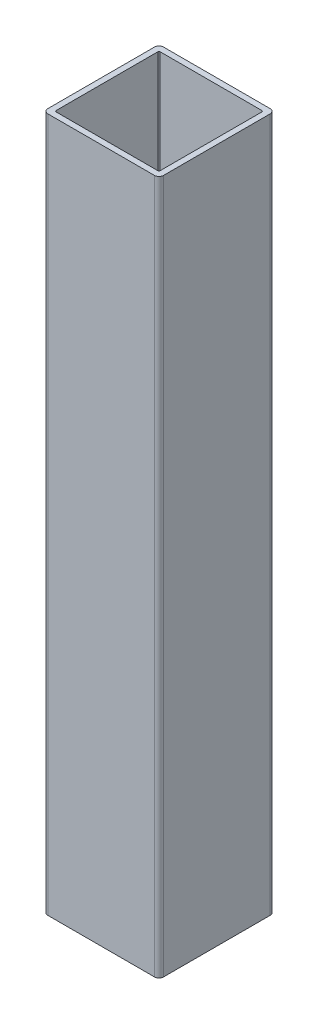
ISO-10303-21;
HEADER;
FILE_DESCRIPTION(('STEP AP214'),'2;1');
FILE_NAME('part.step','',(''),(''),'','','');
FILE_SCHEMA(('AUTOMOTIVE_DESIGN { 1 0 10303 214 1 1 1 1 }'));
ENDSEC;
DATA;
#1=APPLICATION_CONTEXT('core data for automotive mechanical design processes');
#2=APPLICATION_PROTOCOL_DEFINITION('international standard','automotive_design',2000,#1);
#3=PRODUCT_CONTEXT('',#1,'mechanical');
#4=PRODUCT('Part','Part','',(#3));
#5=PRODUCT_RELATED_PRODUCT_CATEGORY('part','',(#4));
#6=PRODUCT_DEFINITION_FORMATION('','',#4);
#7=PRODUCT_DEFINITION_CONTEXT('part definition',#1,'design');
#8=PRODUCT_DEFINITION('design','',#6,#7);
#9=PRODUCT_DEFINITION_SHAPE('','',#8);
#10=(LENGTH_UNIT() NAMED_UNIT(*) SI_UNIT(.MILLI.,.METRE.));
#11=(NAMED_UNIT(*) PLANE_ANGLE_UNIT() SI_UNIT($,.RADIAN.));
#12=(NAMED_UNIT(*) SI_UNIT($,.STERADIAN.) SOLID_ANGLE_UNIT());
#13=UNCERTAINTY_MEASURE_WITH_UNIT(LENGTH_MEASURE(1.E-05),#10,'distance_accuracy_value','');
#14=(GEOMETRIC_REPRESENTATION_CONTEXT(3) GLOBAL_UNCERTAINTY_ASSIGNED_CONTEXT((#13)) GLOBAL_UNIT_ASSIGNED_CONTEXT((#10,
#11,#12)) REPRESENTATION_CONTEXT('',''));
#15=CARTESIAN_POINT('',(0.,0.,0.));
#16=DIRECTION('',(0.,0.,1.));
#17=DIRECTION('',(1.,0.,0.));
#18=AXIS2_PLACEMENT_3D('',#15,#16,#17);
#19=CARTESIAN_POINT('',(-1275.,100.,825.));
#20=DIRECTION('',(0.,0.,-1.));
#21=DIRECTION('',(-1.,0.,0.));
#22=AXIS2_PLACEMENT_3D('',#19,#20,#21);
#23=PLANE('',#22);
#24=DIRECTION('',(-1.,0.,0.));
#25=VECTOR('',#24,1.);
#26=CARTESIAN_POINT('',(-1275.,600.,825.));
#27=LINE('',#26,#25);
#28=CARTESIAN_POINT('',(-1179.,600.,825.));
#29=VERTEX_POINT('',#28);
#30=CARTESIAN_POINT('',(-1271.,600.,825.));
#31=VERTEX_POINT('',#30);
#32=EDGE_CURVE('E169',#29,#31,#27,.T.);
#33=ORIENTED_EDGE('',*,*,#32,.F.);
#34=DIRECTION('',(0.,-1.,0.));
#35=VECTOR('',#34,1.);
#36=CARTESIAN_POINT('',(-1179.,100.,825.));
#37=LINE('',#36,#35);
#38=CARTESIAN_POINT('',(-1179.,0.,825.));
#39=VERTEX_POINT('',#38);
#40=EDGE_CURVE('E245',#29,#39,#37,.T.);
#41=ORIENTED_EDGE('',*,*,#40,.T.);
#42=DIRECTION('',(1.,0.,0.));
#43=VECTOR('',#42,1.);
#44=CARTESIAN_POINT('',(0.,0.,825.));
#45=LINE('',#44,#43);
#46=CARTESIAN_POINT('',(-1271.,0.,825.));
#47=VERTEX_POINT('',#46);
#48=EDGE_CURVE('E212',#47,#39,#45,.T.);
#49=ORIENTED_EDGE('',*,*,#48,.F.);
#50=DIRECTION('',(0.,1.,0.));
#51=VECTOR('',#50,1.);
#52=CARTESIAN_POINT('',(-1271.,600.,825.));
#53=LINE('',#52,#51);
#54=EDGE_CURVE('E241',#47,#31,#53,.T.);
#55=ORIENTED_EDGE('',*,*,#54,.T.);
#56=EDGE_LOOP('',(#33,#41,#49,#55));
#57=FACE_BOUND('',#56,.T.);
#58=ADVANCED_FACE('F19',(#57),#23,.T.);
#59=CARTESIAN_POINT('',(-1175.,100.,825.));
#60=DIRECTION('',(1.,0.,0.));
#61=DIRECTION('',(0.,0.,-1.));
#62=AXIS2_PLACEMENT_3D('',#59,#60,#61);
#63=PLANE('',#62);
#64=DIRECTION('',(0.,0.,-1.));
#65=VECTOR('',#64,1.);
#66=CARTESIAN_POINT('',(-1175.,600.,50.));
#67=LINE('',#66,#65);
#68=CARTESIAN_POINT('',(-1175.,600.,921.));
#69=VERTEX_POINT('',#68);
#70=CARTESIAN_POINT('',(-1175.,600.,829.));
#71=VERTEX_POINT('',#70);
#72=EDGE_CURVE('E214',#69,#71,#67,.T.);
#73=ORIENTED_EDGE('',*,*,#72,.F.);
#74=DIRECTION('',(0.,1.,0.));
#75=VECTOR('',#74,1.);
#76=CARTESIAN_POINT('',(-1175.,100.,921.));
#77=LINE('',#76,#75);
#78=CARTESIAN_POINT('',(-1175.,0.,921.));
#79=VERTEX_POINT('',#78);
#80=EDGE_CURVE('E224',#69,#79,#77,.F.);
#81=ORIENTED_EDGE('',*,*,#80,.T.);
#82=DIRECTION('',(0.,0.,1.));
#83=VECTOR('',#82,1.);
#84=CARTESIAN_POINT('',(-1175.,0.,0.));
#85=LINE('',#84,#83);
#86=CARTESIAN_POINT('',(-1175.,0.,829.));
#87=VERTEX_POINT('',#86);
#88=EDGE_CURVE('E174',#87,#79,#85,.T.);
#89=ORIENTED_EDGE('',*,*,#88,.F.);
#90=DIRECTION('',(0.,-1.,0.));
#91=VECTOR('',#90,1.);
#92=CARTESIAN_POINT('',(-1175.,100.,829.));
#93=LINE('',#92,#91);
#94=EDGE_CURVE('E239',#87,#71,#93,.F.);
#95=ORIENTED_EDGE('',*,*,#94,.T.);
#96=EDGE_LOOP('',(#73,#81,#89,#95));
#97=FACE_BOUND('',#96,.T.);
#98=ADVANCED_FACE('F275',(#97),#63,.T.);
#99=CARTESIAN_POINT('',(0.,0.,0.));
#100=DIRECTION('',(0.,-1.,0.));
#101=DIRECTION('',(0.,0.,-1.));
#102=AXIS2_PLACEMENT_3D('',#99,#100,#101);
#103=PLANE('',#102);
#104=DIRECTION('',(0.,0.,-1.));
#105=VECTOR('',#104,1.);
#106=CARTESIAN_POINT('',(-1270.,0.,0.));
#107=LINE('',#106,#105);
#108=CARTESIAN_POINT('',(-1270.,0.,919.));
#109=VERTEX_POINT('',#108);
#110=CARTESIAN_POINT('',(-1270.,0.,831.));
#111=VERTEX_POINT('',#110);
#112=EDGE_CURVE('E208',#109,#111,#107,.T.);
#113=ORIENTED_EDGE('',*,*,#112,.F.);
#114=CARTESIAN_POINT('',(-1269.,0.,919.));
#115=DIRECTION('',(0.,-1.,0.));
#116=DIRECTION('',(0.,0.,-1.));
#117=AXIS2_PLACEMENT_3D('',#114,#115,#116);
#118=CIRCLE('',#117,1.);
#119=CARTESIAN_POINT('',(-1269.,0.,920.));
#120=VERTEX_POINT('',#119);
#121=EDGE_CURVE('E322',#109,#120,#118,.F.);
#122=ORIENTED_EDGE('',*,*,#121,.T.);
#123=DIRECTION('',(-1.,0.,0.));
#124=VECTOR('',#123,1.);
#125=CARTESIAN_POINT('',(0.,0.,920.));
#126=LINE('',#125,#124);
#127=CARTESIAN_POINT('',(-1181.,0.,920.));
#128=VERTEX_POINT('',#127);
#129=EDGE_CURVE('E206',#128,#120,#126,.T.);
#130=ORIENTED_EDGE('',*,*,#129,.F.);
#131=CARTESIAN_POINT('',(-1181.,0.,919.));
#132=DIRECTION('',(0.,-1.,0.));
#133=DIRECTION('',(0.,0.,-1.));
#134=AXIS2_PLACEMENT_3D('',#131,#132,#133);
#135=CIRCLE('',#134,1.);
#136=CARTESIAN_POINT('',(-1180.,0.,919.));
#137=VERTEX_POINT('',#136);
#138=EDGE_CURVE('E328',#128,#137,#135,.F.);
#139=ORIENTED_EDGE('',*,*,#138,.T.);
#140=DIRECTION('',(0.,0.,1.));
#141=VECTOR('',#140,1.);
#142=CARTESIAN_POINT('',(-1180.,0.,0.));
#143=LINE('',#142,#141);
#144=CARTESIAN_POINT('',(-1180.,0.,831.));
#145=VERTEX_POINT('',#144);
#146=EDGE_CURVE('E200',#145,#137,#143,.T.);
#147=ORIENTED_EDGE('',*,*,#146,.F.);
#148=CARTESIAN_POINT('',(-1181.,0.,831.));
#149=DIRECTION('',(0.,-1.,0.));
#150=DIRECTION('',(0.,0.,-1.));
#151=AXIS2_PLACEMENT_3D('',#148,#149,#150);
#152=CIRCLE('',#151,1.);
#153=CARTESIAN_POINT('',(-1181.,0.,830.));
#154=VERTEX_POINT('',#153);
#155=EDGE_CURVE('E12',#145,#154,#152,.F.);
#156=ORIENTED_EDGE('',*,*,#155,.T.);
#157=DIRECTION('',(1.,0.,0.));
#158=VECTOR('',#157,1.);
#159=CARTESIAN_POINT('',(0.,0.,830.));
#160=LINE('',#159,#158);
#161=CARTESIAN_POINT('',(-1269.,0.,830.));
#162=VERTEX_POINT('',#161);
#163=EDGE_CURVE('E205',#162,#154,#160,.T.);
#164=ORIENTED_EDGE('',*,*,#163,.F.);
#165=CARTESIAN_POINT('',(-1269.,0.,831.));
#166=DIRECTION('',(0.,-1.,0.));
#167=DIRECTION('',(0.,0.,-1.));
#168=AXIS2_PLACEMENT_3D('',#165,#166,#167);
#169=CIRCLE('',#168,1.);
#170=EDGE_CURVE('E315',#162,#111,#169,.F.);
#171=ORIENTED_EDGE('',*,*,#170,.T.);
#172=EDGE_LOOP('',(#113,#122,#130,#139,#147,#156,#164,#171));
#173=FACE_BOUND('',#172,.T.);
#174=DIRECTION('',(1.,0.,0.));
#175=VECTOR('',#174,1.);
#176=CARTESIAN_POINT('',(1175.,0.,925.));
#177=LINE('',#176,#175);
#178=CARTESIAN_POINT('',(-1271.,0.,925.));
#179=VERTEX_POINT('',#178);
#180=CARTESIAN_POINT('',(-1179.,0.,925.));
#181=VERTEX_POINT('',#180);
#182=EDGE_CURVE('E150',#179,#181,#177,.T.);
#183=ORIENTED_EDGE('',*,*,#182,.F.);
#184=CARTESIAN_POINT('',(-1271.,0.,921.));
#185=DIRECTION('',(0.,-1.,0.));
#186=DIRECTION('',(0.,0.,-1.));
#187=AXIS2_PLACEMENT_3D('',#184,#185,#186);
#188=CIRCLE('',#187,4.);
#189=CARTESIAN_POINT('',(-1275.,0.,921.));
#190=VERTEX_POINT('',#189);
#191=EDGE_CURVE('E132',#179,#190,#188,.T.);
#192=ORIENTED_EDGE('',*,*,#191,.T.);
#193=DIRECTION('',(0.,0.,-1.));
#194=VECTOR('',#193,1.);
#195=CARTESIAN_POINT('',(-1275.,0.,0.));
#196=LINE('',#195,#194);
#197=CARTESIAN_POINT('',(-1275.,0.,829.));
#198=VERTEX_POINT('',#197);
#199=EDGE_CURVE('E160',#190,#198,#196,.T.);
#200=ORIENTED_EDGE('',*,*,#199,.T.);
#201=CARTESIAN_POINT('',(-1271.,0.,829.));
#202=DIRECTION('',(0.,-1.,0.));
#203=DIRECTION('',(0.,0.,-1.));
#204=AXIS2_PLACEMENT_3D('',#201,#202,#203);
#205=CIRCLE('',#204,4.);
#206=EDGE_CURVE('E154',#198,#47,#205,.T.);
#207=ORIENTED_EDGE('',*,*,#206,.T.);
#208=ORIENTED_EDGE('',*,*,#48,.T.);
#209=CARTESIAN_POINT('',(-1179.,0.,829.));
#210=DIRECTION('',(0.,-1.,0.));
#211=DIRECTION('',(0.,0.,-1.));
#212=AXIS2_PLACEMENT_3D('',#209,#210,#211);
#213=CIRCLE('',#212,4.);
#214=EDGE_CURVE('E218',#39,#87,#213,.T.);
#215=ORIENTED_EDGE('',*,*,#214,.T.);
#216=ORIENTED_EDGE('',*,*,#88,.T.);
#217=CARTESIAN_POINT('',(-1179.,0.,921.));
#218=DIRECTION('',(0.,-1.,0.));
#219=DIRECTION('',(0.,0.,-1.));
#220=AXIS2_PLACEMENT_3D('',#217,#218,#219);
#221=CIRCLE('',#220,4.);
#222=EDGE_CURVE('E143',#79,#181,#221,.T.);
#223=ORIENTED_EDGE('',*,*,#222,.T.);
#224=EDGE_LOOP('',(#183,#192,#200,#207,#208,#215,#216,#223));
#225=FACE_BOUND('',#224,.T.);
#226=ADVANCED_FACE('F157',(#173,#225),#103,.T.);
#227=CARTESIAN_POINT('',(-1275.,500.,0.));
#228=DIRECTION('',(1.,0.,0.));
#229=DIRECTION('',(0.,0.,-1.));
#230=AXIS2_PLACEMENT_3D('',#227,#228,#229);
#231=PLANE('',#230);
#232=ORIENTED_EDGE('',*,*,#199,.F.);
#233=DIRECTION('',(0.,-1.,0.));
#234=VECTOR('',#233,1.);
#235=CARTESIAN_POINT('',(-1275.,600.,921.));
#236=LINE('',#235,#234);
#237=CARTESIAN_POINT('',(-1275.,600.,921.));
#238=VERTEX_POINT('',#237);
#239=EDGE_CURVE('E137',#190,#238,#236,.F.);
#240=ORIENTED_EDGE('',*,*,#239,.T.);
#241=DIRECTION('',(0.,0.,1.));
#242=VECTOR('',#241,1.);
#243=CARTESIAN_POINT('',(-1275.,600.,50.));
#244=LINE('',#243,#242);
#245=CARTESIAN_POINT('',(-1275.,600.,829.));
#246=VERTEX_POINT('',#245);
#247=EDGE_CURVE('E161',#246,#238,#244,.T.);
#248=ORIENTED_EDGE('',*,*,#247,.F.);
#249=DIRECTION('',(0.,1.,0.));
#250=VECTOR('',#249,1.);
#251=CARTESIAN_POINT('',(-1275.,0.,829.));
#252=LINE('',#251,#250);
#253=EDGE_CURVE('E142',#246,#198,#252,.F.);
#254=ORIENTED_EDGE('',*,*,#253,.T.);
#255=EDGE_LOOP('',(#232,#240,#248,#254));
#256=FACE_BOUND('',#255,.T.);
#257=ADVANCED_FACE('F266',(#256),#231,.F.);
#258=CARTESIAN_POINT('',(1175.,600.,925.));
#259=DIRECTION('',(0.,0.,1.));
#260=DIRECTION('',(1.,0.,0.));
#261=AXIS2_PLACEMENT_3D('',#258,#259,#260);
#262=PLANE('',#261);
#263=DIRECTION('',(1.,0.,0.));
#264=VECTOR('',#263,1.);
#265=CARTESIAN_POINT('',(-1275.,600.,925.));
#266=LINE('',#265,#264);
#267=CARTESIAN_POINT('',(-1271.,600.,925.));
#268=VERTEX_POINT('',#267);
#269=CARTESIAN_POINT('',(-1179.,600.,925.));
#270=VERTEX_POINT('',#269);
#271=EDGE_CURVE('E153',#268,#270,#266,.T.);
#272=ORIENTED_EDGE('',*,*,#271,.F.);
#273=DIRECTION('',(0.,-1.,0.));
#274=VECTOR('',#273,1.);
#275=CARTESIAN_POINT('',(-1271.,0.,925.));
#276=LINE('',#275,#274);
#277=EDGE_CURVE('E136',#268,#179,#276,.T.);
#278=ORIENTED_EDGE('',*,*,#277,.T.);
#279=ORIENTED_EDGE('',*,*,#182,.T.);
#280=DIRECTION('',(0.,1.,0.));
#281=VECTOR('',#280,1.);
#282=CARTESIAN_POINT('',(-1179.,600.,925.));
#283=LINE('',#282,#281);
#284=EDGE_CURVE('E155',#181,#270,#283,.T.);
#285=ORIENTED_EDGE('',*,*,#284,.T.);
#286=EDGE_LOOP('',(#272,#278,#279,#285));
#287=FACE_BOUND('',#286,.T.);
#288=ADVANCED_FACE('F148',(#287),#262,.T.);
#289=CARTESIAN_POINT('',(-1275.,600.,50.));
#290=DIRECTION('',(0.,1.,0.));
#291=DIRECTION('',(0.,0.,1.));
#292=AXIS2_PLACEMENT_3D('',#289,#290,#291);
#293=PLANE('',#292);
#294=DIRECTION('',(0.,0.,1.));
#295=VECTOR('',#294,1.);
#296=CARTESIAN_POINT('',(-1270.,600.,50.));
#297=LINE('',#296,#295);
#298=CARTESIAN_POINT('',(-1270.,600.,831.));
#299=VERTEX_POINT('',#298);
#300=CARTESIAN_POINT('',(-1270.,600.,919.));
#301=VERTEX_POINT('',#300);
#302=EDGE_CURVE('E187',#299,#301,#297,.T.);
#303=ORIENTED_EDGE('',*,*,#302,.F.);
#304=CARTESIAN_POINT('',(-1269.,600.,831.));
#305=DIRECTION('',(0.,1.,0.));
#306=DIRECTION('',(0.,0.,1.));
#307=AXIS2_PLACEMENT_3D('',#304,#305,#306);
#308=CIRCLE('',#307,1.);
#309=CARTESIAN_POINT('',(-1269.,600.,830.));
#310=VERTEX_POINT('',#309);
#311=EDGE_CURVE('E34',#299,#310,#308,.F.);
#312=ORIENTED_EDGE('',*,*,#311,.T.);
#313=DIRECTION('',(-1.,0.,0.));
#314=VECTOR('',#313,1.);
#315=CARTESIAN_POINT('',(-1275.,600.,830.));
#316=LINE('',#315,#314);
#317=CARTESIAN_POINT('',(-1181.,600.,830.));
#318=VERTEX_POINT('',#317);
#319=EDGE_CURVE('E183',#318,#310,#316,.T.);
#320=ORIENTED_EDGE('',*,*,#319,.F.);
#321=CARTESIAN_POINT('',(-1181.,600.,831.));
#322=DIRECTION('',(0.,1.,0.));
#323=DIRECTION('',(0.,0.,1.));
#324=AXIS2_PLACEMENT_3D('',#321,#322,#323);
#325=CIRCLE('',#324,1.);
#326=CARTESIAN_POINT('',(-1180.,600.,831.));
#327=VERTEX_POINT('',#326);
#328=EDGE_CURVE('E27',#318,#327,#325,.F.);
#329=ORIENTED_EDGE('',*,*,#328,.T.);
#330=DIRECTION('',(0.,0.,-1.));
#331=VECTOR('',#330,1.);
#332=CARTESIAN_POINT('',(-1180.,600.,50.));
#333=LINE('',#332,#331);
#334=CARTESIAN_POINT('',(-1180.,600.,919.));
#335=VERTEX_POINT('',#334);
#336=EDGE_CURVE('E188',#335,#327,#333,.T.);
#337=ORIENTED_EDGE('',*,*,#336,.F.);
#338=CARTESIAN_POINT('',(-1181.,600.,919.));
#339=DIRECTION('',(0.,1.,0.));
#340=DIRECTION('',(0.,0.,1.));
#341=AXIS2_PLACEMENT_3D('',#338,#339,#340);
#342=CIRCLE('',#341,1.);
#343=CARTESIAN_POINT('',(-1181.,600.,920.));
#344=VERTEX_POINT('',#343);
#345=EDGE_CURVE('E330',#335,#344,#342,.F.);
#346=ORIENTED_EDGE('',*,*,#345,.T.);
#347=DIRECTION('',(1.,0.,0.));
#348=VECTOR('',#347,1.);
#349=CARTESIAN_POINT('',(-1275.,600.,920.));
#350=LINE('',#349,#348);
#351=CARTESIAN_POINT('',(-1269.,600.,920.));
#352=VERTEX_POINT('',#351);
#353=EDGE_CURVE('E163',#352,#344,#350,.T.);
#354=ORIENTED_EDGE('',*,*,#353,.F.);
#355=CARTESIAN_POINT('',(-1269.,600.,919.));
#356=DIRECTION('',(0.,1.,0.));
#357=DIRECTION('',(0.,0.,1.));
#358=AXIS2_PLACEMENT_3D('',#355,#356,#357);
#359=CIRCLE('',#358,1.);
#360=EDGE_CURVE('E326',#352,#301,#359,.F.);
#361=ORIENTED_EDGE('',*,*,#360,.T.);
#362=EDGE_LOOP('',(#303,#312,#320,#329,#337,#346,#354,#361));
#363=FACE_BOUND('',#362,.T.);
#364=ORIENTED_EDGE('',*,*,#247,.T.);
#365=CARTESIAN_POINT('',(-1271.,600.,921.));
#366=DIRECTION('',(0.,1.,0.));
#367=DIRECTION('',(0.,0.,1.));
#368=AXIS2_PLACEMENT_3D('',#365,#366,#367);
#369=CIRCLE('',#368,4.);
#370=EDGE_CURVE('E237',#238,#268,#369,.T.);
#371=ORIENTED_EDGE('',*,*,#370,.T.);
#372=ORIENTED_EDGE('',*,*,#271,.T.);
#373=CARTESIAN_POINT('',(-1179.,600.,921.));
#374=DIRECTION('',(0.,1.,0.));
#375=DIRECTION('',(0.,0.,1.));
#376=AXIS2_PLACEMENT_3D('',#373,#374,#375);
#377=CIRCLE('',#376,4.);
#378=EDGE_CURVE('E235',#270,#69,#377,.T.);
#379=ORIENTED_EDGE('',*,*,#378,.T.);
#380=ORIENTED_EDGE('',*,*,#72,.T.);
#381=CARTESIAN_POINT('',(-1179.,600.,829.));
#382=DIRECTION('',(0.,1.,0.));
#383=DIRECTION('',(0.,0.,1.));
#384=AXIS2_PLACEMENT_3D('',#381,#382,#383);
#385=CIRCLE('',#384,4.);
#386=EDGE_CURVE('E233',#71,#29,#385,.T.);
#387=ORIENTED_EDGE('',*,*,#386,.T.);
#388=ORIENTED_EDGE('',*,*,#32,.T.);
#389=CARTESIAN_POINT('',(-1271.,600.,829.));
#390=DIRECTION('',(0.,1.,0.));
#391=DIRECTION('',(0.,0.,1.));
#392=AXIS2_PLACEMENT_3D('',#389,#390,#391);
#393=CIRCLE('',#392,4.);
#394=EDGE_CURVE('E231',#31,#246,#393,.T.);
#395=ORIENTED_EDGE('',*,*,#394,.T.);
#396=EDGE_LOOP('',(#364,#371,#372,#379,#380,#387,#388,#395));
#397=FACE_BOUND('',#396,.T.);
#398=ADVANCED_FACE('F264',(#363,#397),#293,.T.);
#399=CARTESIAN_POINT('',(-1270.,-25.,830.));
#400=DIRECTION('',(-1.,0.,0.));
#401=DIRECTION('',(0.,0.,1.));
#402=AXIS2_PLACEMENT_3D('',#399,#400,#401);
#403=PLANE('',#402);
#404=ORIENTED_EDGE('',*,*,#302,.T.);
#405=DIRECTION('',(0.,1.,0.));
#406=VECTOR('',#405,1.);
#407=CARTESIAN_POINT('',(-1270.,0.,919.));
#408=LINE('',#407,#406);
#409=EDGE_CURVE('E335',#301,#109,#408,.F.);
#410=ORIENTED_EDGE('',*,*,#409,.T.);
#411=ORIENTED_EDGE('',*,*,#112,.T.);
#412=DIRECTION('',(0.,1.,0.));
#413=VECTOR('',#412,1.);
#414=CARTESIAN_POINT('',(-1270.,600.,831.));
#415=LINE('',#414,#413);
#416=EDGE_CURVE('E318',#111,#299,#415,.T.);
#417=ORIENTED_EDGE('',*,*,#416,.T.);
#418=EDGE_LOOP('',(#404,#410,#411,#417));
#419=FACE_BOUND('',#418,.T.);
#420=ADVANCED_FACE('F279',(#419),#403,.F.);
#421=CARTESIAN_POINT('',(-1180.,-25.,830.));
#422=DIRECTION('',(0.,0.,-1.));
#423=DIRECTION('',(-1.,0.,0.));
#424=AXIS2_PLACEMENT_3D('',#421,#422,#423);
#425=PLANE('',#424);
#426=ORIENTED_EDGE('',*,*,#319,.T.);
#427=DIRECTION('',(0.,1.,0.));
#428=VECTOR('',#427,1.);
#429=CARTESIAN_POINT('',(-1269.,0.,830.));
#430=LINE('',#429,#428);
#431=EDGE_CURVE('E316',#310,#162,#430,.F.);
#432=ORIENTED_EDGE('',*,*,#431,.T.);
#433=ORIENTED_EDGE('',*,*,#163,.T.);
#434=DIRECTION('',(0.,1.,0.));
#435=VECTOR('',#434,1.);
#436=CARTESIAN_POINT('',(-1181.,600.,830.));
#437=LINE('',#436,#435);
#438=EDGE_CURVE('E333',#154,#318,#437,.T.);
#439=ORIENTED_EDGE('',*,*,#438,.T.);
#440=EDGE_LOOP('',(#426,#432,#433,#439));
#441=FACE_BOUND('',#440,.T.);
#442=ADVANCED_FACE('F354',(#441),#425,.F.);
#443=CARTESIAN_POINT('',(-1180.,-25.,920.));
#444=DIRECTION('',(1.,0.,0.));
#445=DIRECTION('',(0.,0.,-1.));
#446=AXIS2_PLACEMENT_3D('',#443,#444,#445);
#447=PLANE('',#446);
#448=ORIENTED_EDGE('',*,*,#146,.T.);
#449=DIRECTION('',(0.,1.,0.));
#450=VECTOR('',#449,1.);
#451=CARTESIAN_POINT('',(-1180.,600.,919.));
#452=LINE('',#451,#450);
#453=EDGE_CURVE('E342',#137,#335,#452,.T.);
#454=ORIENTED_EDGE('',*,*,#453,.T.);
#455=ORIENTED_EDGE('',*,*,#336,.T.);
#456=DIRECTION('',(0.,1.,0.));
#457=VECTOR('',#456,1.);
#458=CARTESIAN_POINT('',(-1180.,0.,831.));
#459=LINE('',#458,#457);
#460=EDGE_CURVE('E249',#327,#145,#459,.F.);
#461=ORIENTED_EDGE('',*,*,#460,.T.);
#462=EDGE_LOOP('',(#448,#454,#455,#461));
#463=FACE_BOUND('',#462,.T.);
#464=ADVANCED_FACE('F349',(#463),#447,.F.);
#465=CARTESIAN_POINT('',(-1270.,-25.,920.));
#466=DIRECTION('',(0.,0.,1.));
#467=DIRECTION('',(1.,0.,0.));
#468=AXIS2_PLACEMENT_3D('',#465,#466,#467);
#469=PLANE('',#468);
#470=ORIENTED_EDGE('',*,*,#353,.T.);
#471=DIRECTION('',(0.,1.,0.));
#472=VECTOR('',#471,1.);
#473=CARTESIAN_POINT('',(-1181.,0.,920.));
#474=LINE('',#473,#472);
#475=EDGE_CURVE('E338',#344,#128,#474,.F.);
#476=ORIENTED_EDGE('',*,*,#475,.T.);
#477=ORIENTED_EDGE('',*,*,#129,.T.);
#478=DIRECTION('',(0.,1.,0.));
#479=VECTOR('',#478,1.);
#480=CARTESIAN_POINT('',(-1269.,600.,920.));
#481=LINE('',#480,#479);
#482=EDGE_CURVE('E340',#120,#352,#481,.T.);
#483=ORIENTED_EDGE('',*,*,#482,.T.);
#484=EDGE_LOOP('',(#470,#476,#477,#483));
#485=FACE_BOUND('',#484,.T.);
#486=ADVANCED_FACE('F290',(#485),#469,.F.);
#487=CARTESIAN_POINT('',(-1271.,600.,921.));
#488=DIRECTION('',(0.,1.,0.));
#489=DIRECTION('',(0.,0.,1.));
#490=AXIS2_PLACEMENT_3D('',#487,#488,#489);
#491=CYLINDRICAL_SURFACE('',#490,4.);
#492=ORIENTED_EDGE('',*,*,#370,.F.);
#493=ORIENTED_EDGE('',*,*,#239,.F.);
#494=ORIENTED_EDGE('',*,*,#191,.F.);
#495=ORIENTED_EDGE('',*,*,#277,.F.);
#496=EDGE_LOOP('',(#492,#493,#494,#495));
#497=FACE_BOUND('',#496,.T.);
#498=ADVANCED_FACE('F135',(#497),#491,.T.);
#499=CARTESIAN_POINT('',(-1179.,600.,921.));
#500=DIRECTION('',(0.,1.,0.));
#501=DIRECTION('',(0.,0.,1.));
#502=AXIS2_PLACEMENT_3D('',#499,#500,#501);
#503=CYLINDRICAL_SURFACE('',#502,4.);
#504=ORIENTED_EDGE('',*,*,#222,.F.);
#505=ORIENTED_EDGE('',*,*,#80,.F.);
#506=ORIENTED_EDGE('',*,*,#378,.F.);
#507=ORIENTED_EDGE('',*,*,#284,.F.);
#508=EDGE_LOOP('',(#504,#505,#506,#507));
#509=FACE_BOUND('',#508,.T.);
#510=ADVANCED_FACE('F223',(#509),#503,.T.);
#511=CARTESIAN_POINT('',(-1179.,100.,829.));
#512=DIRECTION('',(0.,-1.,0.));
#513=DIRECTION('',(0.,0.,-1.));
#514=AXIS2_PLACEMENT_3D('',#511,#512,#513);
#515=CYLINDRICAL_SURFACE('',#514,4.);
#516=ORIENTED_EDGE('',*,*,#386,.F.);
#517=ORIENTED_EDGE('',*,*,#94,.F.);
#518=ORIENTED_EDGE('',*,*,#214,.F.);
#519=ORIENTED_EDGE('',*,*,#40,.F.);
#520=EDGE_LOOP('',(#516,#517,#518,#519));
#521=FACE_BOUND('',#520,.T.);
#522=ADVANCED_FACE('F293',(#521),#515,.T.);
#523=CARTESIAN_POINT('',(-1271.,100.,829.));
#524=DIRECTION('',(0.,-1.,0.));
#525=DIRECTION('',(0.,0.,-1.));
#526=AXIS2_PLACEMENT_3D('',#523,#524,#525);
#527=CYLINDRICAL_SURFACE('',#526,4.);
#528=ORIENTED_EDGE('',*,*,#206,.F.);
#529=ORIENTED_EDGE('',*,*,#253,.F.);
#530=ORIENTED_EDGE('',*,*,#394,.F.);
#531=ORIENTED_EDGE('',*,*,#54,.F.);
#532=EDGE_LOOP('',(#528,#529,#530,#531));
#533=FACE_BOUND('',#532,.T.);
#534=ADVANCED_FACE('F261',(#533),#527,.T.);
#535=CARTESIAN_POINT('',(-1181.,-25.,919.));
#536=DIRECTION('',(0.,-1.,0.));
#537=DIRECTION('',(0.,0.,-1.));
#538=AXIS2_PLACEMENT_3D('',#535,#536,#537);
#539=CYLINDRICAL_SURFACE('',#538,1.);
#540=ORIENTED_EDGE('',*,*,#138,.F.);
#541=ORIENTED_EDGE('',*,*,#475,.F.);
#542=ORIENTED_EDGE('',*,*,#345,.F.);
#543=ORIENTED_EDGE('',*,*,#453,.F.);
#544=EDGE_LOOP('',(#540,#541,#542,#543));
#545=FACE_BOUND('',#544,.T.);
#546=ADVANCED_FACE('F299',(#545),#539,.F.);
#547=CARTESIAN_POINT('',(-1269.,-25.,919.));
#548=DIRECTION('',(0.,-1.,0.));
#549=DIRECTION('',(0.,0.,-1.));
#550=AXIS2_PLACEMENT_3D('',#547,#548,#549);
#551=CYLINDRICAL_SURFACE('',#550,1.);
#552=ORIENTED_EDGE('',*,*,#121,.F.);
#553=ORIENTED_EDGE('',*,*,#409,.F.);
#554=ORIENTED_EDGE('',*,*,#360,.F.);
#555=ORIENTED_EDGE('',*,*,#482,.F.);
#556=EDGE_LOOP('',(#552,#553,#554,#555));
#557=FACE_BOUND('',#556,.T.);
#558=ADVANCED_FACE('F302',(#557),#551,.F.);
#559=CARTESIAN_POINT('',(-1269.,-25.,831.));
#560=DIRECTION('',(0.,-1.,0.));
#561=DIRECTION('',(0.,0.,-1.));
#562=AXIS2_PLACEMENT_3D('',#559,#560,#561);
#563=CYLINDRICAL_SURFACE('',#562,1.);
#564=ORIENTED_EDGE('',*,*,#170,.F.);
#565=ORIENTED_EDGE('',*,*,#431,.F.);
#566=ORIENTED_EDGE('',*,*,#311,.F.);
#567=ORIENTED_EDGE('',*,*,#416,.F.);
#568=EDGE_LOOP('',(#564,#565,#566,#567));
#569=FACE_BOUND('',#568,.T.);
#570=ADVANCED_FACE('F305',(#569),#563,.F.);
#571=CARTESIAN_POINT('',(-1181.,-25.,831.));
#572=DIRECTION('',(0.,-1.,0.));
#573=DIRECTION('',(0.,0.,-1.));
#574=AXIS2_PLACEMENT_3D('',#571,#572,#573);
#575=CYLINDRICAL_SURFACE('',#574,1.);
#576=ORIENTED_EDGE('',*,*,#155,.F.);
#577=ORIENTED_EDGE('',*,*,#460,.F.);
#578=ORIENTED_EDGE('',*,*,#328,.F.);
#579=ORIENTED_EDGE('',*,*,#438,.F.);
#580=EDGE_LOOP('',(#576,#577,#578,#579));
#581=FACE_BOUND('',#580,.T.);
#582=ADVANCED_FACE('F21',(#581),#575,.F.);
#583=CLOSED_SHELL('',(#58,#98,#226,#257,#288,#398,#420,#442,#464,#486,#498,#510,#522,#534,#546,
#558,#570,#582));
#584=MANIFOLD_SOLID_BREP('B1',#583);
#585=ADVANCED_BREP_SHAPE_REPRESENTATION('',(#18,#584),#14);
#586=SHAPE_DEFINITION_REPRESENTATION(#9,#585);
ENDSEC;
END-ISO-10303-21;
